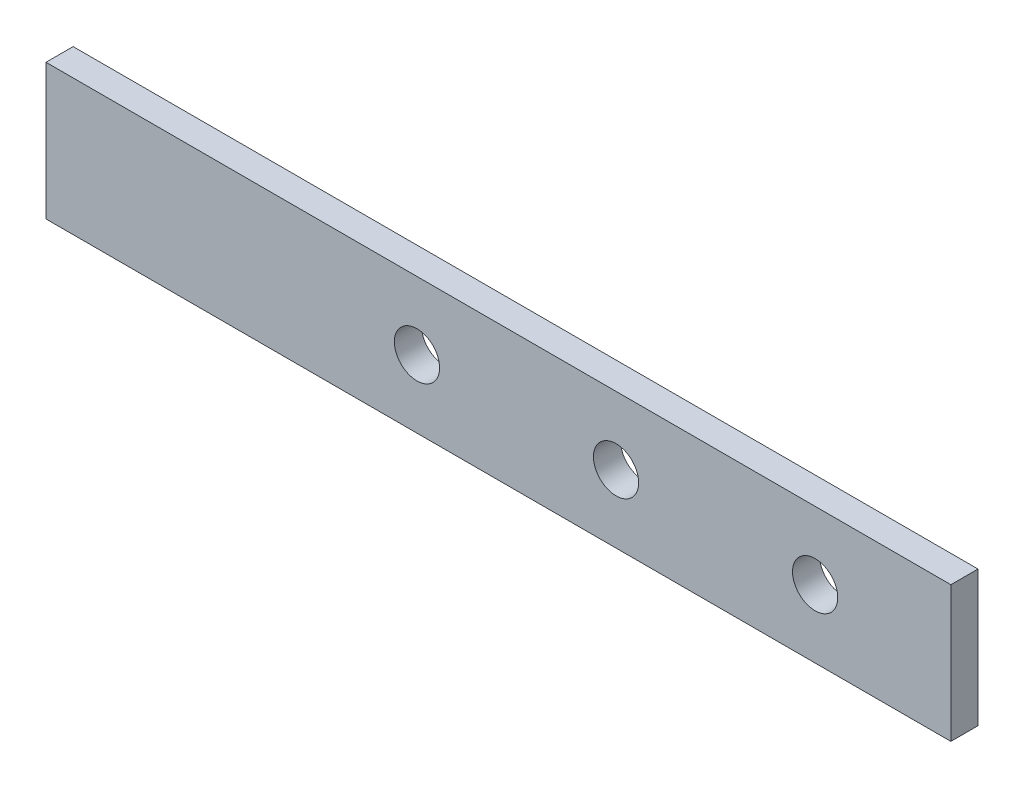
ISO-10303-21;
HEADER;
FILE_DESCRIPTION(('STEP AP214'),'2;1');
FILE_NAME('part.step','',(''),(''),'','','');
FILE_SCHEMA(('AUTOMOTIVE_DESIGN { 1 0 10303 214 1 1 1 1 }'));
ENDSEC;
DATA;
#1=APPLICATION_CONTEXT('core data for automotive mechanical design processes');
#2=APPLICATION_PROTOCOL_DEFINITION('international standard','automotive_design',2000,#1);
#3=PRODUCT_CONTEXT('',#1,'mechanical');
#4=PRODUCT('Part','Part','',(#3));
#5=PRODUCT_RELATED_PRODUCT_CATEGORY('part','',(#4));
#6=PRODUCT_DEFINITION_FORMATION('','',#4);
#7=PRODUCT_DEFINITION_CONTEXT('part definition',#1,'design');
#8=PRODUCT_DEFINITION('design','',#6,#7);
#9=PRODUCT_DEFINITION_SHAPE('','',#8);
#10=(LENGTH_UNIT() NAMED_UNIT(*) SI_UNIT(.MILLI.,.METRE.));
#11=(NAMED_UNIT(*) PLANE_ANGLE_UNIT() SI_UNIT($,.RADIAN.));
#12=(NAMED_UNIT(*) SI_UNIT($,.STERADIAN.) SOLID_ANGLE_UNIT());
#13=UNCERTAINTY_MEASURE_WITH_UNIT(LENGTH_MEASURE(1.E-05),#10,'distance_accuracy_value','');
#14=(GEOMETRIC_REPRESENTATION_CONTEXT(3) GLOBAL_UNCERTAINTY_ASSIGNED_CONTEXT((#13)) GLOBAL_UNIT_ASSIGNED_CONTEXT((#10,
#11,#12)) REPRESENTATION_CONTEXT('',''));
#15=CARTESIAN_POINT('',(0.,0.,0.));
#16=DIRECTION('',(0.,0.,1.));
#17=DIRECTION('',(1.,0.,0.));
#18=AXIS2_PLACEMENT_3D('',#15,#16,#17);
#19=CARTESIAN_POINT('',(500.,75.,-30.));
#20=DIRECTION('',(1.,0.,0.));
#21=DIRECTION('',(0.,0.,-1.));
#22=AXIS2_PLACEMENT_3D('',#19,#20,#21);
#23=PLANE('',#22);
#24=DIRECTION('',(0.,1.,0.));
#25=VECTOR('',#24,1.);
#26=CARTESIAN_POINT('',(500.,75.,0.));
#27=LINE('',#26,#25);
#28=CARTESIAN_POINT('',(500.,-75.,0.));
#29=VERTEX_POINT('',#28);
#30=CARTESIAN_POINT('',(500.,75.,0.));
#31=VERTEX_POINT('',#30);
#32=EDGE_CURVE('E100',#29,#31,#27,.T.);
#33=ORIENTED_EDGE('',*,*,#32,.F.);
#34=DIRECTION('',(0.,0.,1.));
#35=VECTOR('',#34,1.);
#36=CARTESIAN_POINT('',(500.,-75.,-30.));
#37=LINE('',#36,#35);
#38=CARTESIAN_POINT('',(500.,-75.,-30.));
#39=VERTEX_POINT('',#38);
#40=EDGE_CURVE('E11',#39,#29,#37,.T.);
#41=ORIENTED_EDGE('',*,*,#40,.F.);
#42=DIRECTION('',(0.,1.,0.));
#43=VECTOR('',#42,1.);
#44=CARTESIAN_POINT('',(500.,75.,-30.));
#45=LINE('',#44,#43);
#46=CARTESIAN_POINT('',(500.,75.,-30.));
#47=VERTEX_POINT('',#46);
#48=EDGE_CURVE('E93',#39,#47,#45,.T.);
#49=ORIENTED_EDGE('',*,*,#48,.T.);
#50=DIRECTION('',(0.,0.,1.));
#51=VECTOR('',#50,1.);
#52=CARTESIAN_POINT('',(500.,75.,-30.));
#53=LINE('',#52,#51);
#54=EDGE_CURVE('E38',#47,#31,#53,.T.);
#55=ORIENTED_EDGE('',*,*,#54,.T.);
#56=EDGE_LOOP('',(#33,#41,#49,#55));
#57=FACE_BOUND('',#56,.T.);
#58=ADVANCED_FACE('F35',(#57),#23,.T.);
#59=CARTESIAN_POINT('',(-500.,-75.,-30.));
#60=DIRECTION('',(0.,-1.,0.));
#61=DIRECTION('',(0.,0.,-1.));
#62=AXIS2_PLACEMENT_3D('',#59,#60,#61);
#63=PLANE('',#62);
#64=DIRECTION('',(1.,0.,0.));
#65=VECTOR('',#64,1.);
#66=CARTESIAN_POINT('',(-500.,-75.,0.));
#67=LINE('',#66,#65);
#68=CARTESIAN_POINT('',(-500.,-75.,0.));
#69=VERTEX_POINT('',#68);
#70=EDGE_CURVE('E95',#69,#29,#67,.T.);
#71=ORIENTED_EDGE('',*,*,#70,.F.);
#72=DIRECTION('',(0.,0.,1.));
#73=VECTOR('',#72,1.);
#74=CARTESIAN_POINT('',(-500.,-75.,-30.));
#75=LINE('',#74,#73);
#76=CARTESIAN_POINT('',(-500.,-75.,-30.));
#77=VERTEX_POINT('',#76);
#78=EDGE_CURVE('E44',#77,#69,#75,.T.);
#79=ORIENTED_EDGE('',*,*,#78,.F.);
#80=DIRECTION('',(1.,0.,0.));
#81=VECTOR('',#80,1.);
#82=CARTESIAN_POINT('',(-500.,-75.,-30.));
#83=LINE('',#82,#81);
#84=EDGE_CURVE('E90',#77,#39,#83,.T.);
#85=ORIENTED_EDGE('',*,*,#84,.T.);
#86=ORIENTED_EDGE('',*,*,#40,.T.);
#87=EDGE_LOOP('',(#71,#79,#85,#86));
#88=FACE_BOUND('',#87,.T.);
#89=ADVANCED_FACE('F111',(#88),#63,.T.);
#90=CARTESIAN_POINT('',(-500.,75.,-30.));
#91=DIRECTION('',(-1.,0.,0.));
#92=DIRECTION('',(0.,0.,1.));
#93=AXIS2_PLACEMENT_3D('',#90,#91,#92);
#94=PLANE('',#93);
#95=DIRECTION('',(0.,-1.,0.));
#96=VECTOR('',#95,1.);
#97=CARTESIAN_POINT('',(-500.,75.,0.));
#98=LINE('',#97,#96);
#99=CARTESIAN_POINT('',(-500.,75.,0.));
#100=VERTEX_POINT('',#99);
#101=EDGE_CURVE('E85',#100,#69,#98,.T.);
#102=ORIENTED_EDGE('',*,*,#101,.F.);
#103=DIRECTION('',(0.,0.,1.));
#104=VECTOR('',#103,1.);
#105=CARTESIAN_POINT('',(-500.,75.,-30.));
#106=LINE('',#105,#104);
#107=CARTESIAN_POINT('',(-500.,75.,-30.));
#108=VERTEX_POINT('',#107);
#109=EDGE_CURVE('E80',#108,#100,#106,.T.);
#110=ORIENTED_EDGE('',*,*,#109,.F.);
#111=DIRECTION('',(0.,-1.,0.));
#112=VECTOR('',#111,1.);
#113=CARTESIAN_POINT('',(-500.,75.,-30.));
#114=LINE('',#113,#112);
#115=EDGE_CURVE('E83',#108,#77,#114,.T.);
#116=ORIENTED_EDGE('',*,*,#115,.T.);
#117=ORIENTED_EDGE('',*,*,#78,.T.);
#118=EDGE_LOOP('',(#102,#110,#116,#117));
#119=FACE_BOUND('',#118,.T.);
#120=ADVANCED_FACE('F82',(#119),#94,.T.);
#121=CARTESIAN_POINT('',(-500.,75.,-30.));
#122=DIRECTION('',(0.,1.,0.));
#123=DIRECTION('',(0.,0.,1.));
#124=AXIS2_PLACEMENT_3D('',#121,#122,#123);
#125=PLANE('',#124);
#126=DIRECTION('',(-1.,0.,0.));
#127=VECTOR('',#126,1.);
#128=CARTESIAN_POINT('',(-500.,75.,0.));
#129=LINE('',#128,#127);
#130=EDGE_CURVE('E103',#31,#100,#129,.T.);
#131=ORIENTED_EDGE('',*,*,#130,.F.);
#132=ORIENTED_EDGE('',*,*,#54,.F.);
#133=DIRECTION('',(-1.,0.,0.));
#134=VECTOR('',#133,1.);
#135=CARTESIAN_POINT('',(-500.,75.,-30.));
#136=LINE('',#135,#134);
#137=EDGE_CURVE('E89',#47,#108,#136,.T.);
#138=ORIENTED_EDGE('',*,*,#137,.T.);
#139=ORIENTED_EDGE('',*,*,#109,.T.);
#140=EDGE_LOOP('',(#131,#132,#138,#139));
#141=FACE_BOUND('',#140,.T.);
#142=ADVANCED_FACE('F92',(#141),#125,.T.);
#143=CARTESIAN_POINT('',(0.,0.,-30.));
#144=DIRECTION('',(0.,0.,1.));
#145=DIRECTION('',(1.,0.,0.));
#146=AXIS2_PLACEMENT_3D('',#143,#144,#145);
#147=PLANE('',#146);
#148=CARTESIAN_POINT('',(-89.9999999999999,0.,-30.));
#149=DIRECTION('',(0.,0.,1.));
#150=DIRECTION('',(1.,0.,0.));
#151=AXIS2_PLACEMENT_3D('',#148,#149,#150);
#152=CIRCLE('',#151,25.);
#153=CARTESIAN_POINT('',(-64.9999999999999,0.,-30.));
#154=VERTEX_POINT('',#153);
#155=EDGE_CURVE('E148',#154,#154,#152,.T.);
#156=ORIENTED_EDGE('',*,*,#155,.T.);
#157=EDGE_LOOP('',(#156));
#158=FACE_BOUND('',#157,.T.);
#159=CARTESIAN_POINT('',(130.,0.,-30.));
#160=DIRECTION('',(0.,0.,1.));
#161=DIRECTION('',(1.,0.,0.));
#162=AXIS2_PLACEMENT_3D('',#159,#160,#161);
#163=CIRCLE('',#162,25.);
#164=CARTESIAN_POINT('',(155.,0.,-30.));
#165=VERTEX_POINT('',#164);
#166=EDGE_CURVE('E156',#165,#165,#163,.T.);
#167=ORIENTED_EDGE('',*,*,#166,.T.);
#168=EDGE_LOOP('',(#167));
#169=FACE_BOUND('',#168,.T.);
#170=CARTESIAN_POINT('',(350.,0.,-30.));
#171=DIRECTION('',(0.,0.,1.));
#172=DIRECTION('',(1.,0.,0.));
#173=AXIS2_PLACEMENT_3D('',#170,#171,#172);
#174=CIRCLE('',#173,25.);
#175=CARTESIAN_POINT('',(375.,0.,-30.));
#176=VERTEX_POINT('',#175);
#177=EDGE_CURVE('E104',#176,#176,#174,.T.);
#178=ORIENTED_EDGE('',*,*,#177,.T.);
#179=EDGE_LOOP('',(#178));
#180=FACE_BOUND('',#179,.T.);
#181=ORIENTED_EDGE('',*,*,#48,.F.);
#182=ORIENTED_EDGE('',*,*,#84,.F.);
#183=ORIENTED_EDGE('',*,*,#115,.F.);
#184=ORIENTED_EDGE('',*,*,#137,.F.);
#185=EDGE_LOOP('',(#181,#182,#183,#184));
#186=FACE_BOUND('',#185,.T.);
#187=ADVANCED_FACE('F88',(#158,#169,#180,#186),#147,.F.);
#188=CARTESIAN_POINT('',(0.,0.,0.));
#189=DIRECTION('',(0.,0.,1.));
#190=DIRECTION('',(1.,0.,0.));
#191=AXIS2_PLACEMENT_3D('',#188,#189,#190);
#192=PLANE('',#191);
#193=CARTESIAN_POINT('',(-89.9999999999999,0.,0.));
#194=DIRECTION('',(0.,0.,1.));
#195=DIRECTION('',(1.,0.,0.));
#196=AXIS2_PLACEMENT_3D('',#193,#194,#195);
#197=CIRCLE('',#196,25.);
#198=CARTESIAN_POINT('',(-64.9999999999999,0.,0.));
#199=VERTEX_POINT('',#198);
#200=EDGE_CURVE('E151',#199,#199,#197,.T.);
#201=ORIENTED_EDGE('',*,*,#200,.F.);
#202=EDGE_LOOP('',(#201));
#203=FACE_BOUND('',#202,.T.);
#204=CARTESIAN_POINT('',(130.,0.,0.));
#205=DIRECTION('',(0.,0.,1.));
#206=DIRECTION('',(1.,0.,0.));
#207=AXIS2_PLACEMENT_3D('',#204,#205,#206);
#208=CIRCLE('',#207,25.);
#209=CARTESIAN_POINT('',(155.,0.,0.));
#210=VERTEX_POINT('',#209);
#211=EDGE_CURVE('E153',#210,#210,#208,.T.);
#212=ORIENTED_EDGE('',*,*,#211,.F.);
#213=EDGE_LOOP('',(#212));
#214=FACE_BOUND('',#213,.T.);
#215=CARTESIAN_POINT('',(350.,0.,0.));
#216=DIRECTION('',(0.,0.,1.));
#217=DIRECTION('',(1.,0.,0.));
#218=AXIS2_PLACEMENT_3D('',#215,#216,#217);
#219=CIRCLE('',#218,25.);
#220=CARTESIAN_POINT('',(375.,0.,0.));
#221=VERTEX_POINT('',#220);
#222=EDGE_CURVE('E159',#221,#221,#219,.T.);
#223=ORIENTED_EDGE('',*,*,#222,.F.);
#224=EDGE_LOOP('',(#223));
#225=FACE_BOUND('',#224,.T.);
#226=ORIENTED_EDGE('',*,*,#32,.T.);
#227=ORIENTED_EDGE('',*,*,#130,.T.);
#228=ORIENTED_EDGE('',*,*,#101,.T.);
#229=ORIENTED_EDGE('',*,*,#70,.T.);
#230=EDGE_LOOP('',(#226,#227,#228,#229));
#231=FACE_BOUND('',#230,.T.);
#232=ADVANCED_FACE('F110',(#203,#214,#225,#231),#192,.T.);
#233=CARTESIAN_POINT('',(350.,0.,-30.));
#234=DIRECTION('',(0.,0.,1.));
#235=DIRECTION('',(1.,0.,0.));
#236=AXIS2_PLACEMENT_3D('',#233,#234,#235);
#237=CYLINDRICAL_SURFACE('',#236,25.);
#238=ORIENTED_EDGE('',*,*,#177,.F.);
#239=EDGE_LOOP('',(#238));
#240=FACE_BOUND('',#239,.T.);
#241=ORIENTED_EDGE('',*,*,#222,.T.);
#242=EDGE_LOOP('',(#241));
#243=FACE_BOUND('',#242,.T.);
#244=ADVANCED_FACE('F129',(#240,#243),#237,.F.);
#245=CARTESIAN_POINT('',(130.,0.,-30.));
#246=DIRECTION('',(0.,0.,1.));
#247=DIRECTION('',(1.,0.,0.));
#248=AXIS2_PLACEMENT_3D('',#245,#246,#247);
#249=CYLINDRICAL_SURFACE('',#248,25.);
#250=ORIENTED_EDGE('',*,*,#166,.F.);
#251=EDGE_LOOP('',(#250));
#252=FACE_BOUND('',#251,.T.);
#253=ORIENTED_EDGE('',*,*,#211,.T.);
#254=EDGE_LOOP('',(#253));
#255=FACE_BOUND('',#254,.T.);
#256=ADVANCED_FACE('F136',(#252,#255),#249,.F.);
#257=CARTESIAN_POINT('',(-89.9999999999999,0.,-30.));
#258=DIRECTION('',(0.,0.,1.));
#259=DIRECTION('',(1.,0.,0.));
#260=AXIS2_PLACEMENT_3D('',#257,#258,#259);
#261=CYLINDRICAL_SURFACE('',#260,25.);
#262=ORIENTED_EDGE('',*,*,#155,.F.);
#263=EDGE_LOOP('',(#262));
#264=FACE_BOUND('',#263,.T.);
#265=ORIENTED_EDGE('',*,*,#200,.T.);
#266=EDGE_LOOP('',(#265));
#267=FACE_BOUND('',#266,.T.);
#268=ADVANCED_FACE('F140',(#264,#267),#261,.F.);
#269=CLOSED_SHELL('',(#58,#89,#120,#142,#187,#232,#244,#256,#268));
#270=MANIFOLD_SOLID_BREP('B2',#269);
#271=ADVANCED_BREP_SHAPE_REPRESENTATION('',(#18,#270),#14);
#272=SHAPE_DEFINITION_REPRESENTATION(#9,#271);
ENDSEC;
END-ISO-10303-21;
